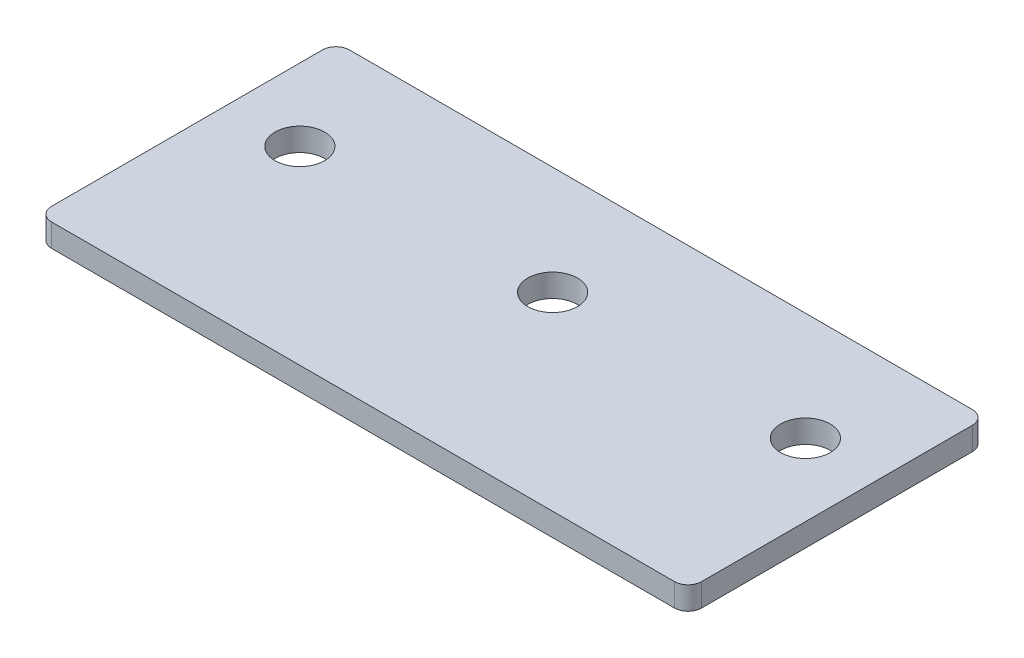
ISO-10303-21;
HEADER;
FILE_DESCRIPTION(('STEP AP214'),'2;1');
FILE_NAME('part.step','',(''),(''),'','','');
FILE_SCHEMA(('AUTOMOTIVE_DESIGN { 1 0 10303 214 1 1 1 1 }'));
ENDSEC;
DATA;
#1=APPLICATION_CONTEXT('core data for automotive mechanical design processes');
#2=APPLICATION_PROTOCOL_DEFINITION('international standard','automotive_design',2000,#1);
#3=PRODUCT_CONTEXT('',#1,'mechanical');
#4=PRODUCT('Part','Part','',(#3));
#5=PRODUCT_RELATED_PRODUCT_CATEGORY('part','',(#4));
#6=PRODUCT_DEFINITION_FORMATION('','',#4);
#7=PRODUCT_DEFINITION_CONTEXT('part definition',#1,'design');
#8=PRODUCT_DEFINITION('design','',#6,#7);
#9=PRODUCT_DEFINITION_SHAPE('','',#8);
#10=(LENGTH_UNIT() NAMED_UNIT(*) SI_UNIT(.MILLI.,.METRE.));
#11=(NAMED_UNIT(*) PLANE_ANGLE_UNIT() SI_UNIT($,.RADIAN.));
#12=(NAMED_UNIT(*) SI_UNIT($,.STERADIAN.) SOLID_ANGLE_UNIT());
#13=UNCERTAINTY_MEASURE_WITH_UNIT(LENGTH_MEASURE(1.E-05),#10,'distance_accuracy_value','');
#14=(GEOMETRIC_REPRESENTATION_CONTEXT(3) GLOBAL_UNCERTAINTY_ASSIGNED_CONTEXT((#13)) GLOBAL_UNIT_ASSIGNED_CONTEXT((#10,
#11,#12)) REPRESENTATION_CONTEXT('',''));
#15=CARTESIAN_POINT('',(0.,0.,0.));
#16=DIRECTION('',(0.,0.,1.));
#17=DIRECTION('',(1.,0.,0.));
#18=AXIS2_PLACEMENT_3D('',#15,#16,#17);
#19=CARTESIAN_POINT('',(0.,2.54,0.));
#20=DIRECTION('',(0.,1.,0.));
#21=DIRECTION('',(0.,0.,1.));
#22=AXIS2_PLACEMENT_3D('',#19,#20,#21);
#23=PLANE('',#22);
#24=CARTESIAN_POINT('',(0.,2.54,-4.5));
#25=DIRECTION('',(0.,1.,0.));
#26=DIRECTION('',(0.,0.,1.));
#27=AXIS2_PLACEMENT_3D('',#24,#25,#26);
#28=CIRCLE('',#27,2.75);
#29=CARTESIAN_POINT('',(0.,2.54,-1.75));
#30=VERTEX_POINT('',#29);
#31=EDGE_CURVE('E182',#30,#30,#28,.T.);
#32=ORIENTED_EDGE('',*,*,#31,.F.);
#33=EDGE_LOOP('',(#32));
#34=FACE_BOUND('',#33,.T.);
#35=DIRECTION('',(-1.,0.,0.));
#36=VECTOR('',#35,1.);
#37=CARTESIAN_POINT('',(36.,2.54,-16.5));
#38=LINE('',#37,#36);
#39=CARTESIAN_POINT('',(34.5,2.54,-16.5));
#40=VERTEX_POINT('',#39);
#41=CARTESIAN_POINT('',(-34.5,2.54,-16.5));
#42=VERTEX_POINT('',#41);
#43=EDGE_CURVE('E137',#40,#42,#38,.T.);
#44=ORIENTED_EDGE('',*,*,#43,.T.);
#45=CARTESIAN_POINT('',(-34.5,2.54,-15.));
#46=DIRECTION('',(0.,1.,0.));
#47=DIRECTION('',(0.,0.,1.));
#48=AXIS2_PLACEMENT_3D('',#45,#46,#47);
#49=CIRCLE('',#48,1.5);
#50=CARTESIAN_POINT('',(-36.,2.54,-15.));
#51=VERTEX_POINT('',#50);
#52=EDGE_CURVE('E156',#42,#51,#49,.T.);
#53=ORIENTED_EDGE('',*,*,#52,.T.);
#54=DIRECTION('',(0.,0.,1.));
#55=VECTOR('',#54,1.);
#56=CARTESIAN_POINT('',(-36.,2.54,16.5));
#57=LINE('',#56,#55);
#58=CARTESIAN_POINT('',(-36.,2.54,15.));
#59=VERTEX_POINT('',#58);
#60=EDGE_CURVE('E120',#51,#59,#57,.T.);
#61=ORIENTED_EDGE('',*,*,#60,.T.);
#62=CARTESIAN_POINT('',(-34.5,2.54,15.));
#63=DIRECTION('',(0.,1.,0.));
#64=DIRECTION('',(0.,0.,1.));
#65=AXIS2_PLACEMENT_3D('',#62,#63,#64);
#66=CIRCLE('',#65,1.5);
#67=CARTESIAN_POINT('',(-34.5,2.54,16.5));
#68=VERTEX_POINT('',#67);
#69=EDGE_CURVE('E151',#59,#68,#66,.T.);
#70=ORIENTED_EDGE('',*,*,#69,.T.);
#71=DIRECTION('',(1.,0.,0.));
#72=VECTOR('',#71,1.);
#73=CARTESIAN_POINT('',(36.,2.54,16.5));
#74=LINE('',#73,#72);
#75=CARTESIAN_POINT('',(34.5,2.54,16.5));
#76=VERTEX_POINT('',#75);
#77=EDGE_CURVE('E167',#68,#76,#74,.T.);
#78=ORIENTED_EDGE('',*,*,#77,.T.);
#79=CARTESIAN_POINT('',(34.5,2.54,15.));
#80=DIRECTION('',(0.,1.,0.));
#81=DIRECTION('',(0.,0.,1.));
#82=AXIS2_PLACEMENT_3D('',#79,#80,#81);
#83=CIRCLE('',#82,1.5);
#84=CARTESIAN_POINT('',(36.,2.54,15.));
#85=VERTEX_POINT('',#84);
#86=EDGE_CURVE('E56',#76,#85,#83,.T.);
#87=ORIENTED_EDGE('',*,*,#86,.T.);
#88=DIRECTION('',(0.,0.,-1.));
#89=VECTOR('',#88,1.);
#90=CARTESIAN_POINT('',(36.,2.54,16.5));
#91=LINE('',#90,#89);
#92=CARTESIAN_POINT('',(36.,2.54,-15.));
#93=VERTEX_POINT('',#92);
#94=EDGE_CURVE('E175',#85,#93,#91,.T.);
#95=ORIENTED_EDGE('',*,*,#94,.T.);
#96=CARTESIAN_POINT('',(34.5,2.54,-15.));
#97=DIRECTION('',(0.,1.,0.));
#98=DIRECTION('',(0.,0.,1.));
#99=AXIS2_PLACEMENT_3D('',#96,#97,#98);
#100=CIRCLE('',#99,1.5);
#101=EDGE_CURVE('E154',#93,#40,#100,.T.);
#102=ORIENTED_EDGE('',*,*,#101,.T.);
#103=EDGE_LOOP('',(#44,#53,#61,#70,#78,#87,#95,#102));
#104=FACE_BOUND('',#103,.T.);
#105=CARTESIAN_POINT('',(-28.,2.54,-4.50000000000001));
#106=DIRECTION('',(0.,1.,0.));
#107=DIRECTION('',(0.,0.,1.));
#108=AXIS2_PLACEMENT_3D('',#105,#106,#107);
#109=CIRCLE('',#108,2.75);
#110=CARTESIAN_POINT('',(-28.,2.54,-1.75));
#111=VERTEX_POINT('',#110);
#112=EDGE_CURVE('E128',#111,#111,#109,.T.);
#113=ORIENTED_EDGE('',*,*,#112,.F.);
#114=EDGE_LOOP('',(#113));
#115=FACE_BOUND('',#114,.T.);
#116=CARTESIAN_POINT('',(28.,2.54,-4.50000000000001));
#117=DIRECTION('',(0.,1.,0.));
#118=DIRECTION('',(0.,0.,-1.));
#119=AXIS2_PLACEMENT_3D('',#116,#117,#118);
#120=CIRCLE('',#119,2.75);
#121=CARTESIAN_POINT('',(28.,2.54,-7.25));
#122=VERTEX_POINT('',#121);
#123=EDGE_CURVE('E187',#122,#122,#120,.T.);
#124=ORIENTED_EDGE('',*,*,#123,.F.);
#125=EDGE_LOOP('',(#124));
#126=FACE_BOUND('',#125,.T.);
#127=ADVANCED_FACE('F34',(#34,#104,#115,#126),#23,.T.);
#128=CARTESIAN_POINT('',(0.,0.,0.));
#129=DIRECTION('',(0.,1.,0.));
#130=DIRECTION('',(0.,0.,1.));
#131=AXIS2_PLACEMENT_3D('',#128,#129,#130);
#132=PLANE('',#131);
#133=CARTESIAN_POINT('',(0.,0.,-4.5));
#134=DIRECTION('',(0.,1.,0.));
#135=DIRECTION('',(0.,0.,1.));
#136=AXIS2_PLACEMENT_3D('',#133,#134,#135);
#137=CIRCLE('',#136,2.75);
#138=CARTESIAN_POINT('',(0.,0.,-1.75));
#139=VERTEX_POINT('',#138);
#140=EDGE_CURVE('E184',#139,#139,#137,.T.);
#141=ORIENTED_EDGE('',*,*,#140,.T.);
#142=EDGE_LOOP('',(#141));
#143=FACE_BOUND('',#142,.T.);
#144=DIRECTION('',(0.,0.,1.));
#145=VECTOR('',#144,1.);
#146=CARTESIAN_POINT('',(-36.,0.,16.5));
#147=LINE('',#146,#145);
#148=CARTESIAN_POINT('',(-36.,0.,-15.));
#149=VERTEX_POINT('',#148);
#150=CARTESIAN_POINT('',(-36.,0.,15.));
#151=VERTEX_POINT('',#150);
#152=EDGE_CURVE('E117',#149,#151,#147,.T.);
#153=ORIENTED_EDGE('',*,*,#152,.F.);
#154=CARTESIAN_POINT('',(-34.5,0.,-15.));
#155=DIRECTION('',(0.,1.,0.));
#156=DIRECTION('',(0.,0.,1.));
#157=AXIS2_PLACEMENT_3D('',#154,#155,#156);
#158=CIRCLE('',#157,1.5);
#159=CARTESIAN_POINT('',(-34.5,0.,-16.5));
#160=VERTEX_POINT('',#159);
#161=EDGE_CURVE('E100',#149,#160,#158,.F.);
#162=ORIENTED_EDGE('',*,*,#161,.T.);
#163=DIRECTION('',(-1.,0.,0.));
#164=VECTOR('',#163,1.);
#165=CARTESIAN_POINT('',(36.,0.,-16.5));
#166=LINE('',#165,#164);
#167=CARTESIAN_POINT('',(34.5,0.,-16.5));
#168=VERTEX_POINT('',#167);
#169=EDGE_CURVE('E141',#168,#160,#166,.T.);
#170=ORIENTED_EDGE('',*,*,#169,.F.);
#171=CARTESIAN_POINT('',(34.5,0.,-15.));
#172=DIRECTION('',(0.,1.,0.));
#173=DIRECTION('',(0.,0.,1.));
#174=AXIS2_PLACEMENT_3D('',#171,#172,#173);
#175=CIRCLE('',#174,1.5);
#176=CARTESIAN_POINT('',(36.,0.,-15.));
#177=VERTEX_POINT('',#176);
#178=EDGE_CURVE('E111',#168,#177,#175,.F.);
#179=ORIENTED_EDGE('',*,*,#178,.T.);
#180=DIRECTION('',(0.,0.,-1.));
#181=VECTOR('',#180,1.);
#182=CARTESIAN_POINT('',(36.,0.,16.5));
#183=LINE('',#182,#181);
#184=CARTESIAN_POINT('',(36.,0.,15.));
#185=VERTEX_POINT('',#184);
#186=EDGE_CURVE('E131',#185,#177,#183,.T.);
#187=ORIENTED_EDGE('',*,*,#186,.F.);
#188=CARTESIAN_POINT('',(34.5,0.,15.));
#189=DIRECTION('',(0.,1.,0.));
#190=DIRECTION('',(0.,0.,1.));
#191=AXIS2_PLACEMENT_3D('',#188,#189,#190);
#192=CIRCLE('',#191,1.5);
#193=CARTESIAN_POINT('',(34.5,0.,16.5));
#194=VERTEX_POINT('',#193);
#195=EDGE_CURVE('E145',#185,#194,#192,.F.);
#196=ORIENTED_EDGE('',*,*,#195,.T.);
#197=DIRECTION('',(1.,0.,0.));
#198=VECTOR('',#197,1.);
#199=CARTESIAN_POINT('',(36.,0.,16.5));
#200=LINE('',#199,#198);
#201=CARTESIAN_POINT('',(-34.5,0.,16.5));
#202=VERTEX_POINT('',#201);
#203=EDGE_CURVE('E127',#202,#194,#200,.T.);
#204=ORIENTED_EDGE('',*,*,#203,.F.);
#205=CARTESIAN_POINT('',(-34.5,0.,15.));
#206=DIRECTION('',(0.,1.,0.));
#207=DIRECTION('',(0.,0.,1.));
#208=AXIS2_PLACEMENT_3D('',#205,#206,#207);
#209=CIRCLE('',#208,1.5);
#210=EDGE_CURVE('E121',#202,#151,#209,.F.);
#211=ORIENTED_EDGE('',*,*,#210,.T.);
#212=EDGE_LOOP('',(#153,#162,#170,#179,#187,#196,#204,#211));
#213=FACE_BOUND('',#212,.T.);
#214=CARTESIAN_POINT('',(-28.,0.,-4.50000000000001));
#215=DIRECTION('',(0.,1.,0.));
#216=DIRECTION('',(0.,0.,1.));
#217=AXIS2_PLACEMENT_3D('',#214,#215,#216);
#218=CIRCLE('',#217,2.75);
#219=CARTESIAN_POINT('',(-28.,0.,-1.75));
#220=VERTEX_POINT('',#219);
#221=EDGE_CURVE('E134',#220,#220,#218,.T.);
#222=ORIENTED_EDGE('',*,*,#221,.T.);
#223=EDGE_LOOP('',(#222));
#224=FACE_BOUND('',#223,.T.);
#225=CARTESIAN_POINT('',(28.,0.,-4.50000000000001));
#226=DIRECTION('',(0.,1.,0.));
#227=DIRECTION('',(0.,0.,-1.));
#228=AXIS2_PLACEMENT_3D('',#225,#226,#227);
#229=CIRCLE('',#228,2.75);
#230=CARTESIAN_POINT('',(28.,0.,-7.25));
#231=VERTEX_POINT('',#230);
#232=EDGE_CURVE('E190',#231,#231,#229,.T.);
#233=ORIENTED_EDGE('',*,*,#232,.T.);
#234=EDGE_LOOP('',(#233));
#235=FACE_BOUND('',#234,.T.);
#236=ADVANCED_FACE('F124',(#143,#213,#224,#235),#132,.F.);
#237=CARTESIAN_POINT('',(-36.,2.54,16.5));
#238=DIRECTION('',(1.,0.,0.));
#239=DIRECTION('',(0.,0.,-1.));
#240=AXIS2_PLACEMENT_3D('',#237,#238,#239);
#241=PLANE('',#240);
#242=ORIENTED_EDGE('',*,*,#60,.F.);
#243=DIRECTION('',(0.,-1.,0.));
#244=VECTOR('',#243,1.);
#245=CARTESIAN_POINT('',(-36.,2.54,-15.));
#246=LINE('',#245,#244);
#247=EDGE_CURVE('E104',#51,#149,#246,.T.);
#248=ORIENTED_EDGE('',*,*,#247,.T.);
#249=ORIENTED_EDGE('',*,*,#152,.T.);
#250=DIRECTION('',(0.,-1.,0.));
#251=VECTOR('',#250,1.);
#252=CARTESIAN_POINT('',(-36.,2.54,15.));
#253=LINE('',#252,#251);
#254=EDGE_CURVE('E122',#151,#59,#253,.F.);
#255=ORIENTED_EDGE('',*,*,#254,.T.);
#256=EDGE_LOOP('',(#242,#248,#249,#255));
#257=FACE_BOUND('',#256,.T.);
#258=ADVANCED_FACE('F116',(#257),#241,.F.);
#259=CARTESIAN_POINT('',(36.,2.54,16.5));
#260=DIRECTION('',(0.,0.,-1.));
#261=DIRECTION('',(-1.,0.,0.));
#262=AXIS2_PLACEMENT_3D('',#259,#260,#261);
#263=PLANE('',#262);
#264=ORIENTED_EDGE('',*,*,#203,.T.);
#265=DIRECTION('',(0.,-1.,0.));
#266=VECTOR('',#265,1.);
#267=CARTESIAN_POINT('',(34.5,2.54,16.5));
#268=LINE('',#267,#266);
#269=EDGE_CURVE('E11',#194,#76,#268,.F.);
#270=ORIENTED_EDGE('',*,*,#269,.T.);
#271=ORIENTED_EDGE('',*,*,#77,.F.);
#272=DIRECTION('',(0.,-1.,0.));
#273=VECTOR('',#272,1.);
#274=CARTESIAN_POINT('',(-34.5,2.54,16.5));
#275=LINE('',#274,#273);
#276=EDGE_CURVE('E42',#68,#202,#275,.T.);
#277=ORIENTED_EDGE('',*,*,#276,.T.);
#278=EDGE_LOOP('',(#264,#270,#271,#277));
#279=FACE_BOUND('',#278,.T.);
#280=ADVANCED_FACE('F165',(#279),#263,.F.);
#281=CARTESIAN_POINT('',(36.,2.54,16.5));
#282=DIRECTION('',(-1.,0.,0.));
#283=DIRECTION('',(0.,0.,1.));
#284=AXIS2_PLACEMENT_3D('',#281,#282,#283);
#285=PLANE('',#284);
#286=ORIENTED_EDGE('',*,*,#186,.T.);
#287=DIRECTION('',(0.,-1.,0.));
#288=VECTOR('',#287,1.);
#289=CARTESIAN_POINT('',(36.,2.54,-15.));
#290=LINE('',#289,#288);
#291=EDGE_CURVE('E49',#177,#93,#290,.F.);
#292=ORIENTED_EDGE('',*,*,#291,.T.);
#293=ORIENTED_EDGE('',*,*,#94,.F.);
#294=DIRECTION('',(0.,-1.,0.));
#295=VECTOR('',#294,1.);
#296=CARTESIAN_POINT('',(36.,2.54,15.));
#297=LINE('',#296,#295);
#298=EDGE_CURVE('E158',#85,#185,#297,.T.);
#299=ORIENTED_EDGE('',*,*,#298,.T.);
#300=EDGE_LOOP('',(#286,#292,#293,#299));
#301=FACE_BOUND('',#300,.T.);
#302=ADVANCED_FACE('F174',(#301),#285,.F.);
#303=CARTESIAN_POINT('',(36.,2.54,-16.5));
#304=DIRECTION('',(0.,0.,1.));
#305=DIRECTION('',(1.,0.,0.));
#306=AXIS2_PLACEMENT_3D('',#303,#304,#305);
#307=PLANE('',#306);
#308=ORIENTED_EDGE('',*,*,#169,.T.);
#309=DIRECTION('',(0.,-1.,0.));
#310=VECTOR('',#309,1.);
#311=CARTESIAN_POINT('',(-34.5,2.54,-16.5));
#312=LINE('',#311,#310);
#313=EDGE_CURVE('E105',#160,#42,#312,.F.);
#314=ORIENTED_EDGE('',*,*,#313,.T.);
#315=ORIENTED_EDGE('',*,*,#43,.F.);
#316=DIRECTION('',(0.,-1.,0.));
#317=VECTOR('',#316,1.);
#318=CARTESIAN_POINT('',(34.5,2.54,-16.5));
#319=LINE('',#318,#317);
#320=EDGE_CURVE('E110',#40,#168,#319,.T.);
#321=ORIENTED_EDGE('',*,*,#320,.T.);
#322=EDGE_LOOP('',(#308,#314,#315,#321));
#323=FACE_BOUND('',#322,.T.);
#324=ADVANCED_FACE('F212',(#323),#307,.F.);
#325=CARTESIAN_POINT('',(-28.,2.54,-4.50000000000001));
#326=DIRECTION('',(0.,-1.,0.));
#327=DIRECTION('',(0.,0.,-1.));
#328=AXIS2_PLACEMENT_3D('',#325,#326,#327);
#329=CYLINDRICAL_SURFACE('',#328,2.75);
#330=ORIENTED_EDGE('',*,*,#112,.T.);
#331=EDGE_LOOP('',(#330));
#332=FACE_BOUND('',#331,.T.);
#333=ORIENTED_EDGE('',*,*,#221,.F.);
#334=EDGE_LOOP('',(#333));
#335=FACE_BOUND('',#334,.T.);
#336=ADVANCED_FACE('F209',(#332,#335),#329,.F.);
#337=CARTESIAN_POINT('',(0.,2.54,-4.5));
#338=DIRECTION('',(0.,-1.,0.));
#339=DIRECTION('',(0.,0.,-1.));
#340=AXIS2_PLACEMENT_3D('',#337,#338,#339);
#341=CYLINDRICAL_SURFACE('',#340,2.75);
#342=ORIENTED_EDGE('',*,*,#31,.T.);
#343=EDGE_LOOP('',(#342));
#344=FACE_BOUND('',#343,.T.);
#345=ORIENTED_EDGE('',*,*,#140,.F.);
#346=EDGE_LOOP('',(#345));
#347=FACE_BOUND('',#346,.T.);
#348=ADVANCED_FACE('F240',(#344,#347),#341,.F.);
#349=CARTESIAN_POINT('',(28.,2.54,-4.50000000000001));
#350=DIRECTION('',(0.,-1.,0.));
#351=DIRECTION('',(0.,0.,-1.));
#352=AXIS2_PLACEMENT_3D('',#349,#350,#351);
#353=CYLINDRICAL_SURFACE('',#352,2.75);
#354=ORIENTED_EDGE('',*,*,#123,.T.);
#355=EDGE_LOOP('',(#354));
#356=FACE_BOUND('',#355,.T.);
#357=ORIENTED_EDGE('',*,*,#232,.F.);
#358=EDGE_LOOP('',(#357));
#359=FACE_BOUND('',#358,.T.);
#360=ADVANCED_FACE('F196',(#356,#359),#353,.F.);
#361=CARTESIAN_POINT('',(-34.5,2.54,-15.));
#362=DIRECTION('',(0.,-1.,0.));
#363=DIRECTION('',(0.,0.,-1.));
#364=AXIS2_PLACEMENT_3D('',#361,#362,#363);
#365=CYLINDRICAL_SURFACE('',#364,1.5);
#366=ORIENTED_EDGE('',*,*,#52,.F.);
#367=ORIENTED_EDGE('',*,*,#313,.F.);
#368=ORIENTED_EDGE('',*,*,#161,.F.);
#369=ORIENTED_EDGE('',*,*,#247,.F.);
#370=EDGE_LOOP('',(#366,#367,#368,#369));
#371=FACE_BOUND('',#370,.T.);
#372=ADVANCED_FACE('F103',(#371),#365,.T.);
#373=CARTESIAN_POINT('',(34.5,2.54,-15.));
#374=DIRECTION('',(0.,-1.,0.));
#375=DIRECTION('',(0.,0.,-1.));
#376=AXIS2_PLACEMENT_3D('',#373,#374,#375);
#377=CYLINDRICAL_SURFACE('',#376,1.5);
#378=ORIENTED_EDGE('',*,*,#101,.F.);
#379=ORIENTED_EDGE('',*,*,#291,.F.);
#380=ORIENTED_EDGE('',*,*,#178,.F.);
#381=ORIENTED_EDGE('',*,*,#320,.F.);
#382=EDGE_LOOP('',(#378,#379,#380,#381));
#383=FACE_BOUND('',#382,.T.);
#384=ADVANCED_FACE('F224',(#383),#377,.T.);
#385=CARTESIAN_POINT('',(34.5,2.54,15.));
#386=DIRECTION('',(0.,-1.,0.));
#387=DIRECTION('',(0.,0.,-1.));
#388=AXIS2_PLACEMENT_3D('',#385,#386,#387);
#389=CYLINDRICAL_SURFACE('',#388,1.5);
#390=ORIENTED_EDGE('',*,*,#86,.F.);
#391=ORIENTED_EDGE('',*,*,#269,.F.);
#392=ORIENTED_EDGE('',*,*,#195,.F.);
#393=ORIENTED_EDGE('',*,*,#298,.F.);
#394=EDGE_LOOP('',(#390,#391,#392,#393));
#395=FACE_BOUND('',#394,.T.);
#396=ADVANCED_FACE('F173',(#395),#389,.T.);
#397=CARTESIAN_POINT('',(-34.5,2.54,15.));
#398=DIRECTION('',(0.,-1.,0.));
#399=DIRECTION('',(0.,0.,-1.));
#400=AXIS2_PLACEMENT_3D('',#397,#398,#399);
#401=CYLINDRICAL_SURFACE('',#400,1.5);
#402=ORIENTED_EDGE('',*,*,#69,.F.);
#403=ORIENTED_EDGE('',*,*,#254,.F.);
#404=ORIENTED_EDGE('',*,*,#210,.F.);
#405=ORIENTED_EDGE('',*,*,#276,.F.);
#406=EDGE_LOOP('',(#402,#403,#404,#405));
#407=FACE_BOUND('',#406,.T.);
#408=ADVANCED_FACE('F36',(#407),#401,.T.);
#409=CLOSED_SHELL('',(#127,#236,#258,#280,#302,#324,#336,#348,#360,#372,#384,#396,#408));
#410=MANIFOLD_SOLID_BREP('B2',#409);
#411=ADVANCED_BREP_SHAPE_REPRESENTATION('',(#18,#410),#14);
#412=SHAPE_DEFINITION_REPRESENTATION(#9,#411);
ENDSEC;
END-ISO-10303-21;
